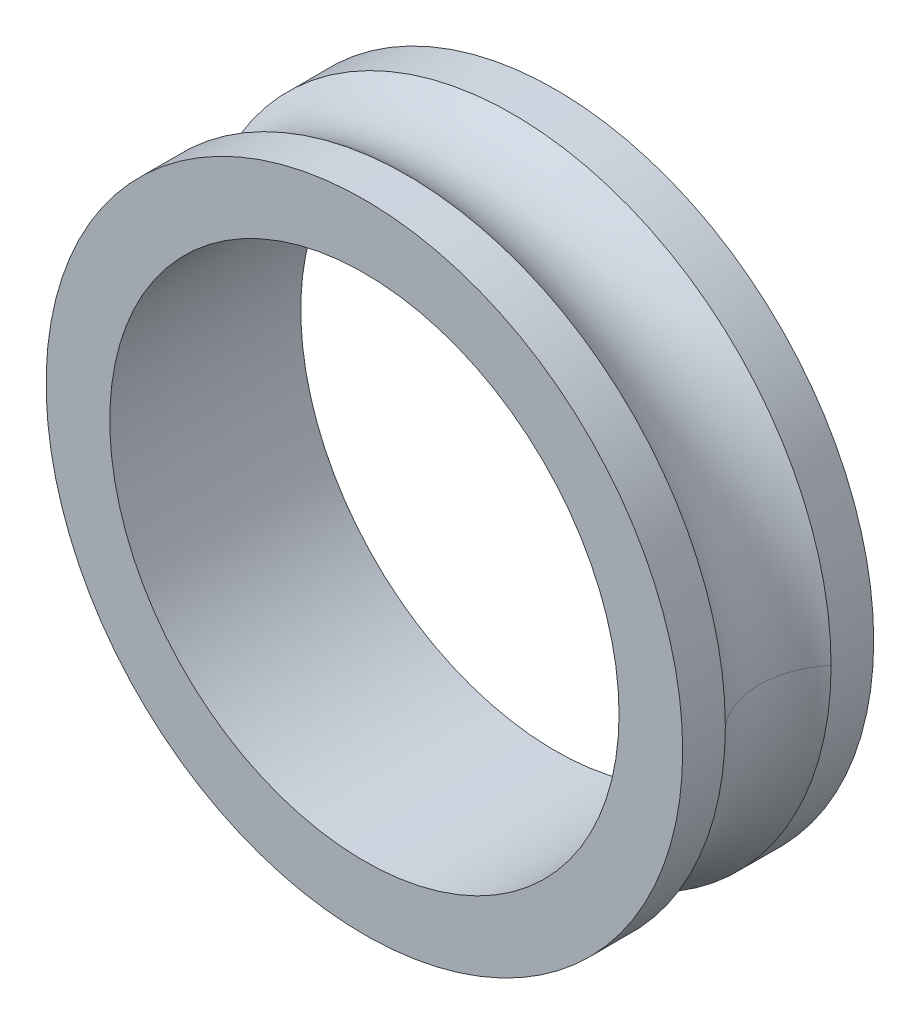
ISO-10303-21;
HEADER;
FILE_DESCRIPTION(('STEP AP214'),'2;1');
FILE_NAME('part.step','',(''),(''),'','','');
FILE_SCHEMA(('AUTOMOTIVE_DESIGN { 1 0 10303 214 1 1 1 1 }'));
ENDSEC;
DATA;
#1=APPLICATION_CONTEXT('core data for automotive mechanical design processes');
#2=APPLICATION_PROTOCOL_DEFINITION('international standard','automotive_design',2000,#1);
#3=PRODUCT_CONTEXT('',#1,'mechanical');
#4=PRODUCT('Part','Part','',(#3));
#5=PRODUCT_RELATED_PRODUCT_CATEGORY('part','',(#4));
#6=PRODUCT_DEFINITION_FORMATION('','',#4);
#7=PRODUCT_DEFINITION_CONTEXT('part definition',#1,'design');
#8=PRODUCT_DEFINITION('design','',#6,#7);
#9=PRODUCT_DEFINITION_SHAPE('','',#8);
#10=(LENGTH_UNIT() NAMED_UNIT(*) SI_UNIT(.MILLI.,.METRE.));
#11=(NAMED_UNIT(*) PLANE_ANGLE_UNIT() SI_UNIT($,.RADIAN.));
#12=(NAMED_UNIT(*) SI_UNIT($,.STERADIAN.) SOLID_ANGLE_UNIT());
#13=UNCERTAINTY_MEASURE_WITH_UNIT(LENGTH_MEASURE(1.E-05),#10,'distance_accuracy_value','');
#14=(GEOMETRIC_REPRESENTATION_CONTEXT(3) GLOBAL_UNCERTAINTY_ASSIGNED_CONTEXT((#13)) GLOBAL_UNIT_ASSIGNED_CONTEXT((#10,
#11,#12)) REPRESENTATION_CONTEXT('',''));
#15=CARTESIAN_POINT('',(0.,0.,0.));
#16=DIRECTION('',(0.,0.,1.));
#17=DIRECTION('',(1.,0.,0.));
#18=AXIS2_PLACEMENT_3D('',#15,#16,#17);
#19=CARTESIAN_POINT('',(0.,0.,7.5));
#20=DIRECTION('',(0.,0.,-1.));
#21=DIRECTION('',(-1.,0.,0.));
#22=AXIS2_PLACEMENT_3D('',#19,#20,#21);
#23=CYLINDRICAL_SURFACE('',#22,25.);
#24=CARTESIAN_POINT('',(0.,0.,-7.5));
#25=DIRECTION('',(0.,0.,1.));
#26=DIRECTION('',(1.,0.,0.));
#27=AXIS2_PLACEMENT_3D('',#24,#25,#26);
#28=CIRCLE('',#27,25.);
#29=CARTESIAN_POINT('',(25.,0.,-7.5));
#30=VERTEX_POINT('',#29);
#31=EDGE_CURVE('E87',#30,#30,#28,.T.);
#32=ORIENTED_EDGE('',*,*,#31,.T.);
#33=EDGE_LOOP('',(#32));
#34=FACE_BOUND('',#33,.T.);
#35=CARTESIAN_POINT('',(0.,0.,-4.15331193145905));
#36=DIRECTION('',(0.,0.,1.));
#37=DIRECTION('',(1.,0.,0.));
#38=AXIS2_PLACEMENT_3D('',#35,#36,#37);
#39=CIRCLE('',#38,25.);
#40=CARTESIAN_POINT('',(25.,0.,-4.15331193145905));
#41=VERTEX_POINT('',#40);
#42=CARTESIAN_POINT('',(0.,-25.,-4.15331193145905));
#43=VERTEX_POINT('',#42);
#44=EDGE_CURVE('E11',#41,#43,#39,.T.);
#45=ORIENTED_EDGE('',*,*,#44,.F.);
#46=CARTESIAN_POINT('',(0.,0.,-4.15331193145905));
#47=DIRECTION('',(0.,0.,1.));
#48=DIRECTION('',(1.,0.,0.));
#49=AXIS2_PLACEMENT_3D('',#46,#47,#48);
#50=CIRCLE('',#49,25.);
#51=EDGE_CURVE('E51',#43,#41,#50,.T.);
#52=ORIENTED_EDGE('',*,*,#51,.F.);
#53=EDGE_LOOP('',(#45,#52));
#54=FACE_BOUND('',#53,.T.);
#55=ADVANCED_FACE('F43',(#34,#54),#23,.T.);
#56=CARTESIAN_POINT('',(0.,0.,7.5));
#57=DIRECTION('',(0.,0.,1.));
#58=DIRECTION('',(1.,0.,0.));
#59=AXIS2_PLACEMENT_3D('',#56,#57,#58);
#60=CIRCLE('',#59,25.);
#61=CARTESIAN_POINT('',(25.,0.,7.5));
#62=VERTEX_POINT('',#61);
#63=EDGE_CURVE('E74',#62,#62,#60,.T.);
#64=ORIENTED_EDGE('',*,*,#63,.F.);
#65=EDGE_LOOP('',(#64));
#66=FACE_BOUND('',#65,.T.);
#67=CARTESIAN_POINT('',(0.,0.,4.15331193145905));
#68=DIRECTION('',(0.,0.,-1.));
#69=DIRECTION('',(-1.,0.,0.));
#70=AXIS2_PLACEMENT_3D('',#67,#68,#69);
#71=CIRCLE('',#70,25.);
#72=CARTESIAN_POINT('',(0.,-25.,4.15331193145905));
#73=VERTEX_POINT('',#72);
#74=CARTESIAN_POINT('',(25.,0.,4.15331193145905));
#75=VERTEX_POINT('',#74);
#76=EDGE_CURVE('E73',#73,#75,#71,.T.);
#77=ORIENTED_EDGE('',*,*,#76,.F.);
#78=CARTESIAN_POINT('',(0.,0.,4.15331193145905));
#79=DIRECTION('',(0.,0.,-1.));
#80=DIRECTION('',(-1.,0.,0.));
#81=AXIS2_PLACEMENT_3D('',#78,#79,#80);
#82=CIRCLE('',#81,25.);
#83=EDGE_CURVE('E68',#75,#73,#82,.T.);
#84=ORIENTED_EDGE('',*,*,#83,.F.);
#85=EDGE_LOOP('',(#77,#84));
#86=FACE_BOUND('',#85,.T.);
#87=ADVANCED_FACE('F82',(#66,#86),#23,.T.);
#88=CARTESIAN_POINT('',(0.,0.,7.5));
#89=DIRECTION('',(0.,0.,1.));
#90=DIRECTION('',(1.,0.,0.));
#91=AXIS2_PLACEMENT_3D('',#88,#89,#90);
#92=PLANE('',#91);
#93=ORIENTED_EDGE('',*,*,#63,.T.);
#94=EDGE_LOOP('',(#93));
#95=FACE_BOUND('',#94,.T.);
#96=CARTESIAN_POINT('',(0.,0.,7.5));
#97=DIRECTION('',(0.,0.,1.));
#98=DIRECTION('',(1.,0.,0.));
#99=AXIS2_PLACEMENT_3D('',#96,#97,#98);
#100=CIRCLE('',#99,20.);
#101=CARTESIAN_POINT('',(20.,0.,7.5));
#102=VERTEX_POINT('',#101);
#103=EDGE_CURVE('E91',#102,#102,#100,.T.);
#104=ORIENTED_EDGE('',*,*,#103,.F.);
#105=EDGE_LOOP('',(#104));
#106=FACE_BOUND('',#105,.T.);
#107=ADVANCED_FACE('F108',(#95,#106),#92,.T.);
#108=CARTESIAN_POINT('',(0.,0.,-7.5));
#109=DIRECTION('',(0.,0.,1.));
#110=DIRECTION('',(1.,0.,0.));
#111=AXIS2_PLACEMENT_3D('',#108,#109,#110);
#112=PLANE('',#111);
#113=ORIENTED_EDGE('',*,*,#31,.F.);
#114=EDGE_LOOP('',(#113));
#115=FACE_BOUND('',#114,.T.);
#116=CARTESIAN_POINT('',(0.,0.,-7.5));
#117=DIRECTION('',(0.,0.,1.));
#118=DIRECTION('',(1.,0.,0.));
#119=AXIS2_PLACEMENT_3D('',#116,#117,#118);
#120=CIRCLE('',#119,20.);
#121=CARTESIAN_POINT('',(20.,0.,-7.5));
#122=VERTEX_POINT('',#121);
#123=EDGE_CURVE('E95',#122,#122,#120,.T.);
#124=ORIENTED_EDGE('',*,*,#123,.T.);
#125=EDGE_LOOP('',(#124));
#126=FACE_BOUND('',#125,.T.);
#127=ADVANCED_FACE('F110',(#115,#126),#112,.F.);
#128=CARTESIAN_POINT('',(0.,0.,7.5));
#129=DIRECTION('',(0.,0.,-1.));
#130=DIRECTION('',(-1.,0.,0.));
#131=AXIS2_PLACEMENT_3D('',#128,#129,#130);
#132=CYLINDRICAL_SURFACE('',#131,20.);
#133=ORIENTED_EDGE('',*,*,#103,.T.);
#134=EDGE_LOOP('',(#133));
#135=FACE_BOUND('',#134,.T.);
#136=ORIENTED_EDGE('',*,*,#123,.F.);
#137=EDGE_LOOP('',(#136));
#138=FACE_BOUND('',#137,.T.);
#139=ADVANCED_FACE('F105',(#135,#138),#132,.F.);
#140=CARTESIAN_POINT('',(0.,0.,0.));
#141=DIRECTION('',(0.,0.,-1.));
#142=DIRECTION('',(-1.,0.,0.));
#143=AXIS2_PLACEMENT_3D('',#140,#141,#142);
#144=TOROIDAL_SURFACE('',#143,30.,6.50000000000001);
#145=ORIENTED_EDGE('',*,*,#44,.T.);
#146=CARTESIAN_POINT('',(0.,-30.,0.));
#147=DIRECTION('',(1.,0.,0.));
#148=DIRECTION('',(0.,0.,-1.));
#149=AXIS2_PLACEMENT_3D('',#146,#147,#148);
#150=CIRCLE('',#149,6.50000000000001);
#151=EDGE_CURVE('E58',#43,#73,#150,.T.);
#152=ORIENTED_EDGE('',*,*,#151,.T.);
#153=ORIENTED_EDGE('',*,*,#76,.T.);
#154=CARTESIAN_POINT('',(30.,0.,0.));
#155=DIRECTION('',(0.,1.,0.));
#156=DIRECTION('',(0.,0.,-1.));
#157=AXIS2_PLACEMENT_3D('',#154,#155,#156);
#158=CIRCLE('',#157,6.50000000000001);
#159=EDGE_CURVE('E62',#41,#75,#158,.T.);
#160=ORIENTED_EDGE('',*,*,#159,.F.);
#161=EDGE_LOOP('',(#145,#152,#153,#160));
#162=FACE_BOUND('',#161,.T.);
#163=ADVANCED_FACE('F77',(#162),#144,.F.);
#164=CARTESIAN_POINT('',(0.,0.,0.));
#165=DIRECTION('',(0.,0.,-1.));
#166=DIRECTION('',(-1.,0.,0.));
#167=AXIS2_PLACEMENT_3D('',#164,#165,#166);
#168=TOROIDAL_SURFACE('',#167,30.,6.50000000000001);
#169=ORIENTED_EDGE('',*,*,#51,.T.);
#170=ORIENTED_EDGE('',*,*,#159,.T.);
#171=ORIENTED_EDGE('',*,*,#83,.T.);
#172=ORIENTED_EDGE('',*,*,#151,.F.);
#173=EDGE_LOOP('',(#169,#170,#171,#172));
#174=FACE_BOUND('',#173,.T.);
#175=ADVANCED_FACE('F69',(#174),#168,.F.);
#176=CLOSED_SHELL('',(#55,#87,#107,#127,#139,#163,#175));
#177=MANIFOLD_SOLID_BREP('B2',#176);
#178=ADVANCED_BREP_SHAPE_REPRESENTATION('',(#18,#177),#14);
#179=SHAPE_DEFINITION_REPRESENTATION(#9,#178);
ENDSEC;
END-ISO-10303-21;
